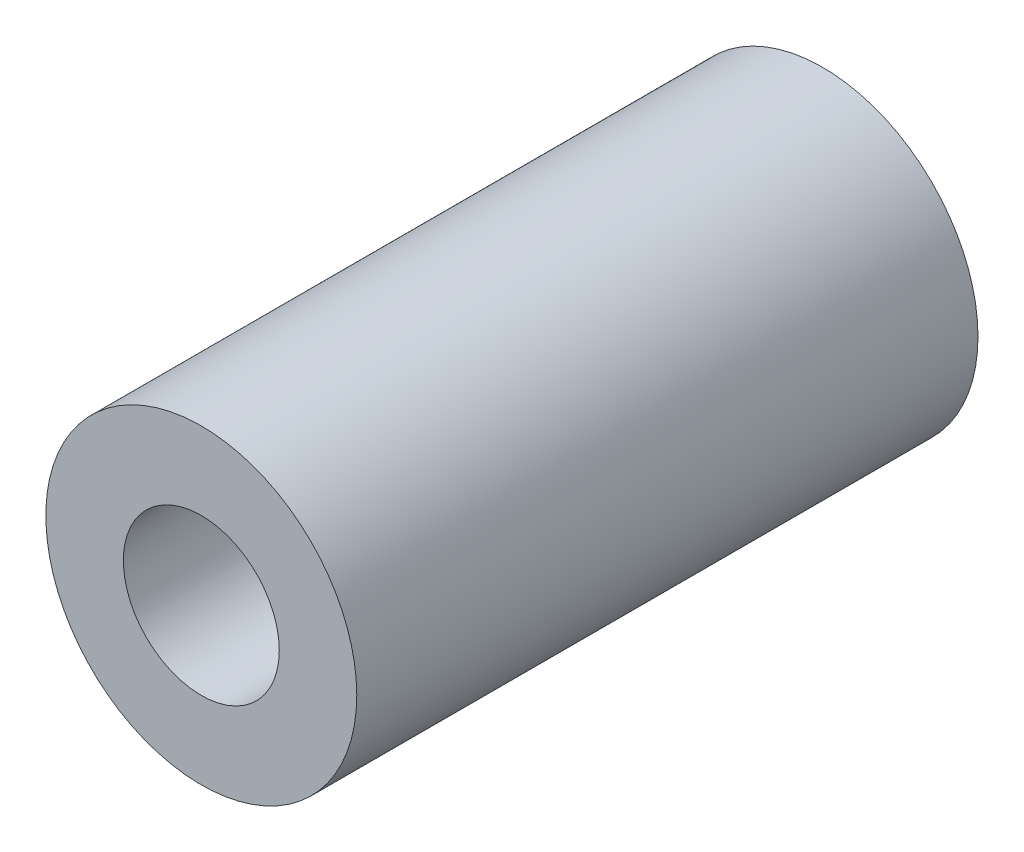
ISO-10303-21;
HEADER;
FILE_DESCRIPTION(('STEP AP214'),'2;1');
FILE_NAME('part.step','',(''),(''),'','','');
FILE_SCHEMA(('AUTOMOTIVE_DESIGN { 1 0 10303 214 1 1 1 1 }'));
ENDSEC;
DATA;
#1=APPLICATION_CONTEXT('core data for automotive mechanical design processes');
#2=APPLICATION_PROTOCOL_DEFINITION('international standard','automotive_design',2000,#1);
#3=PRODUCT_CONTEXT('',#1,'mechanical');
#4=PRODUCT('Part','Part','',(#3));
#5=PRODUCT_RELATED_PRODUCT_CATEGORY('part','',(#4));
#6=PRODUCT_DEFINITION_FORMATION('','',#4);
#7=PRODUCT_DEFINITION_CONTEXT('part definition',#1,'design');
#8=PRODUCT_DEFINITION('design','',#6,#7);
#9=PRODUCT_DEFINITION_SHAPE('','',#8);
#10=(LENGTH_UNIT() NAMED_UNIT(*) SI_UNIT(.MILLI.,.METRE.));
#11=(NAMED_UNIT(*) PLANE_ANGLE_UNIT() SI_UNIT($,.RADIAN.));
#12=(NAMED_UNIT(*) SI_UNIT($,.STERADIAN.) SOLID_ANGLE_UNIT());
#13=UNCERTAINTY_MEASURE_WITH_UNIT(LENGTH_MEASURE(1.E-05),#10,'distance_accuracy_value','');
#14=(GEOMETRIC_REPRESENTATION_CONTEXT(3) GLOBAL_UNCERTAINTY_ASSIGNED_CONTEXT((#13)) GLOBAL_UNIT_ASSIGNED_CONTEXT((#10,
#11,#12)) REPRESENTATION_CONTEXT('',''));
#15=CARTESIAN_POINT('',(0.,0.,0.));
#16=DIRECTION('',(0.,0.,1.));
#17=DIRECTION('',(1.,0.,0.));
#18=AXIS2_PLACEMENT_3D('',#15,#16,#17);
#19=CARTESIAN_POINT('',(0.,0.,12.7));
#20=DIRECTION('',(0.,0.,1.));
#21=DIRECTION('',(1.,0.,0.));
#22=AXIS2_PLACEMENT_3D('',#19,#20,#21);
#23=PLANE('',#22);
#24=CARTESIAN_POINT('',(0.,0.,12.7));
#25=DIRECTION('',(0.,0.,1.));
#26=DIRECTION('',(1.,0.,0.));
#27=AXIS2_PLACEMENT_3D('',#24,#25,#26);
#28=CIRCLE('',#27,6.35635);
#29=CARTESIAN_POINT('',(6.35635,0.,12.7));
#30=VERTEX_POINT('',#29);
#31=EDGE_CURVE('E10',#30,#30,#28,.T.);
#32=ORIENTED_EDGE('',*,*,#31,.T.);
#33=EDGE_LOOP('',(#32));
#34=FACE_BOUND('',#33,.T.);
#35=CARTESIAN_POINT('',(0.,0.,12.7));
#36=DIRECTION('',(0.,0.,1.));
#37=DIRECTION('',(1.,0.,0.));
#38=AXIS2_PLACEMENT_3D('',#35,#36,#37);
#39=CIRCLE('',#38,3.1877);
#40=CARTESIAN_POINT('',(3.1877,0.,12.7));
#41=VERTEX_POINT('',#40);
#42=EDGE_CURVE('E41',#41,#41,#39,.T.);
#43=ORIENTED_EDGE('',*,*,#42,.F.);
#44=EDGE_LOOP('',(#43));
#45=FACE_BOUND('',#44,.T.);
#46=ADVANCED_FACE('F30',(#34,#45),#23,.T.);
#47=CARTESIAN_POINT('',(0.,0.,-12.7));
#48=DIRECTION('',(0.,0.,1.));
#49=DIRECTION('',(1.,0.,0.));
#50=AXIS2_PLACEMENT_3D('',#47,#48,#49);
#51=PLANE('',#50);
#52=CARTESIAN_POINT('',(0.,0.,-12.7));
#53=DIRECTION('',(0.,0.,1.));
#54=DIRECTION('',(1.,0.,0.));
#55=AXIS2_PLACEMENT_3D('',#52,#53,#54);
#56=CIRCLE('',#55,6.35635);
#57=CARTESIAN_POINT('',(6.35635,0.,-12.7));
#58=VERTEX_POINT('',#57);
#59=EDGE_CURVE('E34',#58,#58,#56,.T.);
#60=ORIENTED_EDGE('',*,*,#59,.F.);
#61=EDGE_LOOP('',(#60));
#62=FACE_BOUND('',#61,.T.);
#63=CARTESIAN_POINT('',(0.,0.,-12.7));
#64=DIRECTION('',(0.,0.,1.));
#65=DIRECTION('',(1.,0.,0.));
#66=AXIS2_PLACEMENT_3D('',#63,#64,#65);
#67=CIRCLE('',#66,3.1877);
#68=CARTESIAN_POINT('',(3.1877,0.,-12.7));
#69=VERTEX_POINT('',#68);
#70=EDGE_CURVE('E43',#69,#69,#67,.T.);
#71=ORIENTED_EDGE('',*,*,#70,.T.);
#72=EDGE_LOOP('',(#71));
#73=FACE_BOUND('',#72,.T.);
#74=ADVANCED_FACE('F53',(#62,#73),#51,.F.);
#75=CARTESIAN_POINT('',(0.,0.,12.7));
#76=DIRECTION('',(0.,0.,-1.));
#77=DIRECTION('',(-1.,0.,0.));
#78=AXIS2_PLACEMENT_3D('',#75,#76,#77);
#79=CYLINDRICAL_SURFACE('',#78,6.35635);
#80=ORIENTED_EDGE('',*,*,#31,.F.);
#81=EDGE_LOOP('',(#80));
#82=FACE_BOUND('',#81,.T.);
#83=ORIENTED_EDGE('',*,*,#59,.T.);
#84=EDGE_LOOP('',(#83));
#85=FACE_BOUND('',#84,.T.);
#86=ADVANCED_FACE('F32',(#82,#85),#79,.T.);
#87=CARTESIAN_POINT('',(0.,0.,12.7));
#88=DIRECTION('',(0.,0.,-1.));
#89=DIRECTION('',(-1.,0.,0.));
#90=AXIS2_PLACEMENT_3D('',#87,#88,#89);
#91=CYLINDRICAL_SURFACE('',#90,3.1877);
#92=ORIENTED_EDGE('',*,*,#42,.T.);
#93=EDGE_LOOP('',(#92));
#94=FACE_BOUND('',#93,.T.);
#95=ORIENTED_EDGE('',*,*,#70,.F.);
#96=EDGE_LOOP('',(#95));
#97=FACE_BOUND('',#96,.T.);
#98=ADVANCED_FACE('F49',(#94,#97),#91,.F.);
#99=CLOSED_SHELL('',(#46,#74,#86,#98));
#100=MANIFOLD_SOLID_BREP('B2',#99);
#101=ADVANCED_BREP_SHAPE_REPRESENTATION('',(#18,#100),#14);
#102=SHAPE_DEFINITION_REPRESENTATION(#9,#101);
ENDSEC;
END-ISO-10303-21;
